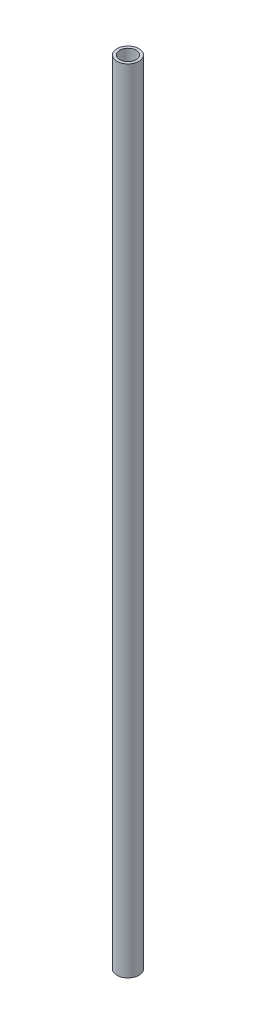
ISO-10303-21;
HEADER;
FILE_DESCRIPTION(('STEP AP214'),'2;1');
FILE_NAME('part.step','',(''),(''),'','','');
FILE_SCHEMA(('AUTOMOTIVE_DESIGN { 1 0 10303 214 1 1 1 1 }'));
ENDSEC;
DATA;
#1=APPLICATION_CONTEXT('core data for automotive mechanical design processes');
#2=APPLICATION_PROTOCOL_DEFINITION('international standard','automotive_design',2000,#1);
#3=PRODUCT_CONTEXT('',#1,'mechanical');
#4=PRODUCT('Part','Part','',(#3));
#5=PRODUCT_RELATED_PRODUCT_CATEGORY('part','',(#4));
#6=PRODUCT_DEFINITION_FORMATION('','',#4);
#7=PRODUCT_DEFINITION_CONTEXT('part definition',#1,'design');
#8=PRODUCT_DEFINITION('design','',#6,#7);
#9=PRODUCT_DEFINITION_SHAPE('','',#8);
#10=(LENGTH_UNIT() NAMED_UNIT(*) SI_UNIT(.MILLI.,.METRE.));
#11=(NAMED_UNIT(*) PLANE_ANGLE_UNIT() SI_UNIT($,.RADIAN.));
#12=(NAMED_UNIT(*) SI_UNIT($,.STERADIAN.) SOLID_ANGLE_UNIT());
#13=UNCERTAINTY_MEASURE_WITH_UNIT(LENGTH_MEASURE(1.E-05),#10,'distance_accuracy_value','');
#14=(GEOMETRIC_REPRESENTATION_CONTEXT(3) GLOBAL_UNCERTAINTY_ASSIGNED_CONTEXT((#13)) GLOBAL_UNIT_ASSIGNED_CONTEXT((#10,
#11,#12)) REPRESENTATION_CONTEXT('',''));
#15=CARTESIAN_POINT('',(0.,0.,0.));
#16=DIRECTION('',(0.,0.,1.));
#17=DIRECTION('',(1.,0.,0.));
#18=AXIS2_PLACEMENT_3D('',#15,#16,#17);
#19=CARTESIAN_POINT('',(0.,457.2,0.));
#20=DIRECTION('',(0.,1.,0.));
#21=DIRECTION('',(0.,0.,1.));
#22=AXIS2_PLACEMENT_3D('',#19,#20,#21);
#23=PLANE('',#22);
#24=CARTESIAN_POINT('',(0.,457.2,0.));
#25=DIRECTION('',(0.,1.,0.));
#26=DIRECTION('',(0.,0.,1.));
#27=AXIS2_PLACEMENT_3D('',#24,#25,#26);
#28=CIRCLE('',#27,6.35);
#29=CARTESIAN_POINT('',(0.,457.2,6.35));
#30=VERTEX_POINT('',#29);
#31=EDGE_CURVE('E10',#30,#30,#28,.T.);
#32=ORIENTED_EDGE('',*,*,#31,.T.);
#33=EDGE_LOOP('',(#32));
#34=FACE_BOUND('',#33,.T.);
#35=CARTESIAN_POINT('',(0.,457.2,0.));
#36=DIRECTION('',(0.,1.,0.));
#37=DIRECTION('',(0.,0.,1.));
#38=AXIS2_PLACEMENT_3D('',#35,#36,#37);
#39=CIRCLE('',#38,4.7625);
#40=CARTESIAN_POINT('',(0.,457.2,4.7625));
#41=VERTEX_POINT('',#40);
#42=EDGE_CURVE('E42',#41,#41,#39,.T.);
#43=ORIENTED_EDGE('',*,*,#42,.F.);
#44=EDGE_LOOP('',(#43));
#45=FACE_BOUND('',#44,.T.);
#46=ADVANCED_FACE('F31',(#34,#45),#23,.T.);
#47=CARTESIAN_POINT('',(0.,0.,0.));
#48=DIRECTION('',(0.,1.,0.));
#49=DIRECTION('',(0.,0.,1.));
#50=AXIS2_PLACEMENT_3D('',#47,#48,#49);
#51=PLANE('',#50);
#52=CARTESIAN_POINT('',(0.,0.,0.));
#53=DIRECTION('',(0.,1.,0.));
#54=DIRECTION('',(0.,0.,1.));
#55=AXIS2_PLACEMENT_3D('',#52,#53,#54);
#56=CIRCLE('',#55,6.35);
#57=CARTESIAN_POINT('',(0.,0.,6.35));
#58=VERTEX_POINT('',#57);
#59=EDGE_CURVE('E35',#58,#58,#56,.T.);
#60=ORIENTED_EDGE('',*,*,#59,.F.);
#61=EDGE_LOOP('',(#60));
#62=FACE_BOUND('',#61,.T.);
#63=CARTESIAN_POINT('',(0.,0.,0.));
#64=DIRECTION('',(0.,1.,0.));
#65=DIRECTION('',(0.,0.,1.));
#66=AXIS2_PLACEMENT_3D('',#63,#64,#65);
#67=CIRCLE('',#66,4.7625);
#68=CARTESIAN_POINT('',(0.,0.,4.7625));
#69=VERTEX_POINT('',#68);
#70=EDGE_CURVE('E44',#69,#69,#67,.T.);
#71=ORIENTED_EDGE('',*,*,#70,.T.);
#72=EDGE_LOOP('',(#71));
#73=FACE_BOUND('',#72,.T.);
#74=ADVANCED_FACE('F54',(#62,#73),#51,.F.);
#75=CARTESIAN_POINT('',(0.,457.2,0.));
#76=DIRECTION('',(0.,-1.,0.));
#77=DIRECTION('',(0.,0.,-1.));
#78=AXIS2_PLACEMENT_3D('',#75,#76,#77);
#79=CYLINDRICAL_SURFACE('',#78,6.35);
#80=ORIENTED_EDGE('',*,*,#31,.F.);
#81=EDGE_LOOP('',(#80));
#82=FACE_BOUND('',#81,.T.);
#83=ORIENTED_EDGE('',*,*,#59,.T.);
#84=EDGE_LOOP('',(#83));
#85=FACE_BOUND('',#84,.T.);
#86=ADVANCED_FACE('F33',(#82,#85),#79,.T.);
#87=CARTESIAN_POINT('',(0.,457.2,0.));
#88=DIRECTION('',(0.,-1.,0.));
#89=DIRECTION('',(0.,0.,-1.));
#90=AXIS2_PLACEMENT_3D('',#87,#88,#89);
#91=CYLINDRICAL_SURFACE('',#90,4.7625);
#92=ORIENTED_EDGE('',*,*,#42,.T.);
#93=EDGE_LOOP('',(#92));
#94=FACE_BOUND('',#93,.T.);
#95=ORIENTED_EDGE('',*,*,#70,.F.);
#96=EDGE_LOOP('',(#95));
#97=FACE_BOUND('',#96,.T.);
#98=ADVANCED_FACE('F50',(#94,#97),#91,.F.);
#99=CLOSED_SHELL('',(#46,#74,#86,#98));
#100=MANIFOLD_SOLID_BREP('B2',#99);
#101=ADVANCED_BREP_SHAPE_REPRESENTATION('',(#18,#100),#14);
#102=SHAPE_DEFINITION_REPRESENTATION(#9,#101);
ENDSEC;
END-ISO-10303-21;
